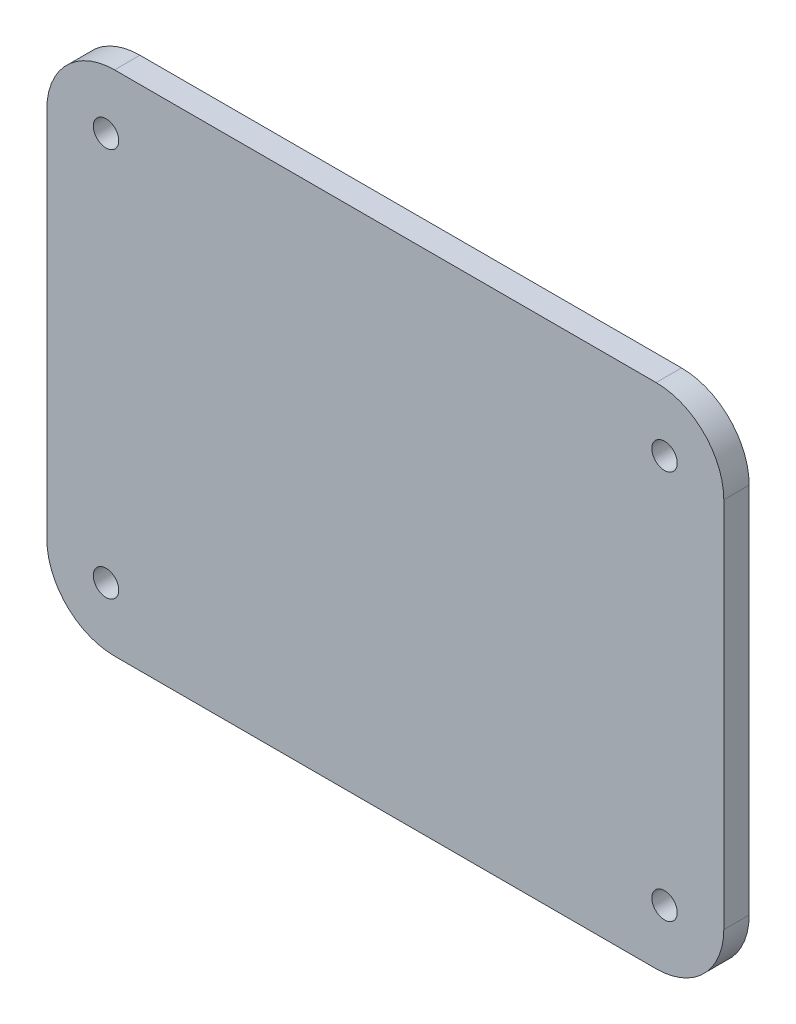
ISO-10303-21;
HEADER;
FILE_DESCRIPTION(('STEP AP214'),'2;1');
FILE_NAME('part.step','',(''),(''),'','','');
FILE_SCHEMA(('AUTOMOTIVE_DESIGN { 1 0 10303 214 1 1 1 1 }'));
ENDSEC;
DATA;
#1=APPLICATION_CONTEXT('core data for automotive mechanical design processes');
#2=APPLICATION_PROTOCOL_DEFINITION('international standard','automotive_design',2000,#1);
#3=PRODUCT_CONTEXT('',#1,'mechanical');
#4=PRODUCT('Part','Part','',(#3));
#5=PRODUCT_RELATED_PRODUCT_CATEGORY('part','',(#4));
#6=PRODUCT_DEFINITION_FORMATION('','',#4);
#7=PRODUCT_DEFINITION_CONTEXT('part definition',#1,'design');
#8=PRODUCT_DEFINITION('design','',#6,#7);
#9=PRODUCT_DEFINITION_SHAPE('','',#8);
#10=(LENGTH_UNIT() NAMED_UNIT(*) SI_UNIT(.MILLI.,.METRE.));
#11=(NAMED_UNIT(*) PLANE_ANGLE_UNIT() SI_UNIT($,.RADIAN.));
#12=(NAMED_UNIT(*) SI_UNIT($,.STERADIAN.) SOLID_ANGLE_UNIT());
#13=UNCERTAINTY_MEASURE_WITH_UNIT(LENGTH_MEASURE(1.E-05),#10,'distance_accuracy_value','');
#14=(GEOMETRIC_REPRESENTATION_CONTEXT(3) GLOBAL_UNCERTAINTY_ASSIGNED_CONTEXT((#13)) GLOBAL_UNIT_ASSIGNED_CONTEXT((#10,
#11,#12)) REPRESENTATION_CONTEXT('',''));
#15=CARTESIAN_POINT('',(0.,0.,0.));
#16=DIRECTION('',(0.,0.,1.));
#17=DIRECTION('',(1.,0.,0.));
#18=AXIS2_PLACEMENT_3D('',#15,#16,#17);
#19=CARTESIAN_POINT('',(-40.,30.,3.));
#20=DIRECTION('',(1.,0.,0.));
#21=DIRECTION('',(0.,1.,0.));
#22=AXIS2_PLACEMENT_3D('',#19,#20,#21);
#23=PLANE('',#22);
#24=DIRECTION('',(0.,-1.,0.));
#25=VECTOR('',#24,1.);
#26=CARTESIAN_POINT('',(-40.,30.,3.));
#27=LINE('',#26,#25);
#28=CARTESIAN_POINT('',(-40.,22.,3.));
#29=VERTEX_POINT('',#28);
#30=CARTESIAN_POINT('',(-40.,-22.,3.));
#31=VERTEX_POINT('',#30);
#32=EDGE_CURVE('E118',#29,#31,#27,.T.);
#33=ORIENTED_EDGE('',*,*,#32,.F.);
#34=DIRECTION('',(0.,0.,-1.));
#35=VECTOR('',#34,1.);
#36=CARTESIAN_POINT('',(-40.,22.,3.));
#37=LINE('',#36,#35);
#38=CARTESIAN_POINT('',(-40.,22.,0.));
#39=VERTEX_POINT('',#38);
#40=EDGE_CURVE('E103',#29,#39,#37,.T.);
#41=ORIENTED_EDGE('',*,*,#40,.T.);
#42=DIRECTION('',(0.,-1.,0.));
#43=VECTOR('',#42,1.);
#44=CARTESIAN_POINT('',(-40.,30.,0.));
#45=LINE('',#44,#43);
#46=CARTESIAN_POINT('',(-40.,-22.,0.));
#47=VERTEX_POINT('',#46);
#48=EDGE_CURVE('E115',#39,#47,#45,.T.);
#49=ORIENTED_EDGE('',*,*,#48,.T.);
#50=DIRECTION('',(0.,0.,-1.));
#51=VECTOR('',#50,1.);
#52=CARTESIAN_POINT('',(-40.,-22.,3.));
#53=LINE('',#52,#51);
#54=EDGE_CURVE('E120',#47,#31,#53,.F.);
#55=ORIENTED_EDGE('',*,*,#54,.T.);
#56=EDGE_LOOP('',(#33,#41,#49,#55));
#57=FACE_BOUND('',#56,.T.);
#58=ADVANCED_FACE('F33',(#57),#23,.F.);
#59=CARTESIAN_POINT('',(-40.,-30.,3.));
#60=DIRECTION('',(0.,1.,0.));
#61=DIRECTION('',(0.,0.,1.));
#62=AXIS2_PLACEMENT_3D('',#59,#60,#61);
#63=PLANE('',#62);
#64=DIRECTION('',(1.,0.,0.));
#65=VECTOR('',#64,1.);
#66=CARTESIAN_POINT('',(-40.,-30.,3.));
#67=LINE('',#66,#65);
#68=CARTESIAN_POINT('',(-32.,-30.,3.));
#69=VERTEX_POINT('',#68);
#70=CARTESIAN_POINT('',(32.,-30.,3.));
#71=VERTEX_POINT('',#70);
#72=EDGE_CURVE('E164',#69,#71,#67,.T.);
#73=ORIENTED_EDGE('',*,*,#72,.F.);
#74=DIRECTION('',(0.,0.,-1.));
#75=VECTOR('',#74,1.);
#76=CARTESIAN_POINT('',(-32.,-30.,3.));
#77=LINE('',#76,#75);
#78=CARTESIAN_POINT('',(-32.,-30.,0.));
#79=VERTEX_POINT('',#78);
#80=EDGE_CURVE('E157',#69,#79,#77,.T.);
#81=ORIENTED_EDGE('',*,*,#80,.T.);
#82=DIRECTION('',(1.,0.,0.));
#83=VECTOR('',#82,1.);
#84=CARTESIAN_POINT('',(-40.,-30.,0.));
#85=LINE('',#84,#83);
#86=CARTESIAN_POINT('',(32.,-30.,0.));
#87=VERTEX_POINT('',#86);
#88=EDGE_CURVE('E124',#79,#87,#85,.T.);
#89=ORIENTED_EDGE('',*,*,#88,.T.);
#90=DIRECTION('',(0.,0.,-1.));
#91=VECTOR('',#90,1.);
#92=CARTESIAN_POINT('',(32.,-30.,3.));
#93=LINE('',#92,#91);
#94=EDGE_CURVE('E155',#87,#71,#93,.F.);
#95=ORIENTED_EDGE('',*,*,#94,.T.);
#96=EDGE_LOOP('',(#73,#81,#89,#95));
#97=FACE_BOUND('',#96,.T.);
#98=ADVANCED_FACE('F162',(#97),#63,.F.);
#99=CARTESIAN_POINT('',(40.,30.,3.));
#100=DIRECTION('',(-1.,0.,0.));
#101=DIRECTION('',(0.,-1.,0.));
#102=AXIS2_PLACEMENT_3D('',#99,#100,#101);
#103=PLANE('',#102);
#104=DIRECTION('',(0.,1.,0.));
#105=VECTOR('',#104,1.);
#106=CARTESIAN_POINT('',(40.,30.,3.));
#107=LINE('',#106,#105);
#108=CARTESIAN_POINT('',(40.,-22.,3.));
#109=VERTEX_POINT('',#108);
#110=CARTESIAN_POINT('',(40.,22.,3.));
#111=VERTEX_POINT('',#110);
#112=EDGE_CURVE('E172',#109,#111,#107,.T.);
#113=ORIENTED_EDGE('',*,*,#112,.F.);
#114=DIRECTION('',(0.,0.,-1.));
#115=VECTOR('',#114,1.);
#116=CARTESIAN_POINT('',(40.,-22.,3.));
#117=LINE('',#116,#115);
#118=CARTESIAN_POINT('',(40.,-22.,0.));
#119=VERTEX_POINT('',#118);
#120=EDGE_CURVE('E11',#109,#119,#117,.T.);
#121=ORIENTED_EDGE('',*,*,#120,.T.);
#122=DIRECTION('',(0.,1.,0.));
#123=VECTOR('',#122,1.);
#124=CARTESIAN_POINT('',(40.,30.,0.));
#125=LINE('',#124,#123);
#126=CARTESIAN_POINT('',(40.,22.,0.));
#127=VERTEX_POINT('',#126);
#128=EDGE_CURVE('E128',#119,#127,#125,.T.);
#129=ORIENTED_EDGE('',*,*,#128,.T.);
#130=DIRECTION('',(0.,0.,-1.));
#131=VECTOR('',#130,1.);
#132=CARTESIAN_POINT('',(40.,22.,3.));
#133=LINE('',#132,#131);
#134=EDGE_CURVE('E41',#127,#111,#133,.F.);
#135=ORIENTED_EDGE('',*,*,#134,.T.);
#136=EDGE_LOOP('',(#113,#121,#129,#135));
#137=FACE_BOUND('',#136,.T.);
#138=ADVANCED_FACE('F171',(#137),#103,.F.);
#139=CARTESIAN_POINT('',(-40.,30.,3.));
#140=DIRECTION('',(0.,-1.,0.));
#141=DIRECTION('',(0.,0.,-1.));
#142=AXIS2_PLACEMENT_3D('',#139,#140,#141);
#143=PLANE('',#142);
#144=DIRECTION('',(-1.,0.,0.));
#145=VECTOR('',#144,1.);
#146=CARTESIAN_POINT('',(-40.,30.,0.));
#147=LINE('',#146,#145);
#148=CARTESIAN_POINT('',(32.,30.,0.));
#149=VERTEX_POINT('',#148);
#150=CARTESIAN_POINT('',(-32.,30.,0.));
#151=VERTEX_POINT('',#150);
#152=EDGE_CURVE('E138',#149,#151,#147,.T.);
#153=ORIENTED_EDGE('',*,*,#152,.T.);
#154=DIRECTION('',(0.,0.,-1.));
#155=VECTOR('',#154,1.);
#156=CARTESIAN_POINT('',(-32.,30.,3.));
#157=LINE('',#156,#155);
#158=CARTESIAN_POINT('',(-32.,30.,3.));
#159=VERTEX_POINT('',#158);
#160=EDGE_CURVE('E104',#151,#159,#157,.F.);
#161=ORIENTED_EDGE('',*,*,#160,.T.);
#162=DIRECTION('',(-1.,0.,0.));
#163=VECTOR('',#162,1.);
#164=CARTESIAN_POINT('',(-40.,30.,3.));
#165=LINE('',#164,#163);
#166=CARTESIAN_POINT('',(32.,30.,3.));
#167=VERTEX_POINT('',#166);
#168=EDGE_CURVE('E134',#167,#159,#165,.T.);
#169=ORIENTED_EDGE('',*,*,#168,.F.);
#170=DIRECTION('',(0.,0.,-1.));
#171=VECTOR('',#170,1.);
#172=CARTESIAN_POINT('',(32.,30.,3.));
#173=LINE('',#172,#171);
#174=EDGE_CURVE('E109',#167,#149,#173,.T.);
#175=ORIENTED_EDGE('',*,*,#174,.T.);
#176=EDGE_LOOP('',(#153,#161,#169,#175));
#177=FACE_BOUND('',#176,.T.);
#178=ADVANCED_FACE('F216',(#177),#143,.F.);
#179=CARTESIAN_POINT('',(0.,0.,3.));
#180=DIRECTION('',(0.,0.,1.));
#181=DIRECTION('',(1.,0.,0.));
#182=AXIS2_PLACEMENT_3D('',#179,#180,#181);
#183=PLANE('',#182);
#184=CARTESIAN_POINT('',(33.,-23.,3.));
#185=DIRECTION('',(0.,0.,1.));
#186=DIRECTION('',(1.,0.,0.));
#187=AXIS2_PLACEMENT_3D('',#184,#185,#186);
#188=CIRCLE('',#187,1.50000000000002);
#189=CARTESIAN_POINT('',(31.5,-23.,3.));
#190=VERTEX_POINT('',#189);
#191=EDGE_CURVE('E181',#190,#190,#188,.F.);
#192=ORIENTED_EDGE('',*,*,#191,.T.);
#193=EDGE_LOOP('',(#192));
#194=FACE_BOUND('',#193,.T.);
#195=CARTESIAN_POINT('',(33.,23.,3.));
#196=DIRECTION('',(0.,0.,1.));
#197=DIRECTION('',(1.,0.,0.));
#198=AXIS2_PLACEMENT_3D('',#195,#196,#197);
#199=CIRCLE('',#198,1.50000000000002);
#200=CARTESIAN_POINT('',(31.5,23.,3.));
#201=VERTEX_POINT('',#200);
#202=EDGE_CURVE('E188',#201,#201,#199,.F.);
#203=ORIENTED_EDGE('',*,*,#202,.T.);
#204=EDGE_LOOP('',(#203));
#205=FACE_BOUND('',#204,.T.);
#206=CARTESIAN_POINT('',(-33.,23.,3.));
#207=DIRECTION('',(0.,0.,1.));
#208=DIRECTION('',(1.,0.,0.));
#209=AXIS2_PLACEMENT_3D('',#206,#207,#208);
#210=CIRCLE('',#209,1.49999999999999);
#211=CARTESIAN_POINT('',(-34.5,23.,3.));
#212=VERTEX_POINT('',#211);
#213=EDGE_CURVE('E180',#212,#212,#210,.F.);
#214=ORIENTED_EDGE('',*,*,#213,.T.);
#215=EDGE_LOOP('',(#214));
#216=FACE_BOUND('',#215,.T.);
#217=CARTESIAN_POINT('',(-33.,-23.,3.));
#218=DIRECTION('',(0.,0.,1.));
#219=DIRECTION('',(1.,0.,0.));
#220=AXIS2_PLACEMENT_3D('',#217,#218,#219);
#221=CIRCLE('',#220,1.5);
#222=CARTESIAN_POINT('',(-34.5,-23.,3.));
#223=VERTEX_POINT('',#222);
#224=EDGE_CURVE('E125',#223,#223,#221,.F.);
#225=ORIENTED_EDGE('',*,*,#224,.T.);
#226=EDGE_LOOP('',(#225));
#227=FACE_BOUND('',#226,.T.);
#228=ORIENTED_EDGE('',*,*,#168,.T.);
#229=CARTESIAN_POINT('',(-32.,22.,3.));
#230=DIRECTION('',(0.,0.,1.));
#231=DIRECTION('',(1.,0.,0.));
#232=AXIS2_PLACEMENT_3D('',#229,#230,#231);
#233=CIRCLE('',#232,8.);
#234=EDGE_CURVE('E153',#159,#29,#233,.T.);
#235=ORIENTED_EDGE('',*,*,#234,.T.);
#236=ORIENTED_EDGE('',*,*,#32,.T.);
#237=CARTESIAN_POINT('',(-32.,-22.,3.));
#238=DIRECTION('',(0.,0.,1.));
#239=DIRECTION('',(1.,0.,0.));
#240=AXIS2_PLACEMENT_3D('',#237,#238,#239);
#241=CIRCLE('',#240,8.);
#242=EDGE_CURVE('E151',#31,#69,#241,.T.);
#243=ORIENTED_EDGE('',*,*,#242,.T.);
#244=ORIENTED_EDGE('',*,*,#72,.T.);
#245=CARTESIAN_POINT('',(32.,-22.,3.));
#246=DIRECTION('',(0.,0.,1.));
#247=DIRECTION('',(1.,0.,0.));
#248=AXIS2_PLACEMENT_3D('',#245,#246,#247);
#249=CIRCLE('',#248,8.);
#250=EDGE_CURVE('E54',#71,#109,#249,.T.);
#251=ORIENTED_EDGE('',*,*,#250,.T.);
#252=ORIENTED_EDGE('',*,*,#112,.T.);
#253=CARTESIAN_POINT('',(32.,22.,3.));
#254=DIRECTION('',(0.,0.,1.));
#255=DIRECTION('',(1.,0.,0.));
#256=AXIS2_PLACEMENT_3D('',#253,#254,#255);
#257=CIRCLE('',#256,8.);
#258=EDGE_CURVE('E148',#111,#167,#257,.T.);
#259=ORIENTED_EDGE('',*,*,#258,.T.);
#260=EDGE_LOOP('',(#228,#235,#236,#243,#244,#251,#252,#259));
#261=FACE_BOUND('',#260,.T.);
#262=ADVANCED_FACE('F204',(#194,#205,#216,#227,#261),#183,.T.);
#263=CARTESIAN_POINT('',(0.,0.,0.));
#264=DIRECTION('',(0.,0.,1.));
#265=DIRECTION('',(1.,0.,0.));
#266=AXIS2_PLACEMENT_3D('',#263,#264,#265);
#267=PLANE('',#266);
#268=CARTESIAN_POINT('',(33.,-23.,0.));
#269=DIRECTION('',(0.,0.,-1.));
#270=DIRECTION('',(-1.,0.,0.));
#271=AXIS2_PLACEMENT_3D('',#268,#269,#270);
#272=CIRCLE('',#271,1.50000000000002);
#273=CARTESIAN_POINT('',(31.5,-23.,0.));
#274=VERTEX_POINT('',#273);
#275=EDGE_CURVE('E185',#274,#274,#272,.T.);
#276=ORIENTED_EDGE('',*,*,#275,.F.);
#277=EDGE_LOOP('',(#276));
#278=FACE_BOUND('',#277,.T.);
#279=CARTESIAN_POINT('',(33.,23.,0.));
#280=DIRECTION('',(0.,0.,-1.));
#281=DIRECTION('',(-1.,0.,0.));
#282=AXIS2_PLACEMENT_3D('',#279,#280,#281);
#283=CIRCLE('',#282,1.50000000000002);
#284=CARTESIAN_POINT('',(31.5,23.,0.));
#285=VERTEX_POINT('',#284);
#286=EDGE_CURVE('E184',#285,#285,#283,.T.);
#287=ORIENTED_EDGE('',*,*,#286,.F.);
#288=EDGE_LOOP('',(#287));
#289=FACE_BOUND('',#288,.T.);
#290=CARTESIAN_POINT('',(-33.,23.,0.));
#291=DIRECTION('',(0.,0.,-1.));
#292=DIRECTION('',(-1.,0.,0.));
#293=AXIS2_PLACEMENT_3D('',#290,#291,#292);
#294=CIRCLE('',#293,1.49999999999999);
#295=CARTESIAN_POINT('',(-34.5,23.,0.));
#296=VERTEX_POINT('',#295);
#297=EDGE_CURVE('E191',#296,#296,#294,.T.);
#298=ORIENTED_EDGE('',*,*,#297,.F.);
#299=EDGE_LOOP('',(#298));
#300=FACE_BOUND('',#299,.T.);
#301=CARTESIAN_POINT('',(-33.,-23.,0.));
#302=DIRECTION('',(0.,0.,-1.));
#303=DIRECTION('',(-1.,0.,0.));
#304=AXIS2_PLACEMENT_3D('',#301,#302,#303);
#305=CIRCLE('',#304,1.5);
#306=CARTESIAN_POINT('',(-34.5,-23.,0.));
#307=VERTEX_POINT('',#306);
#308=EDGE_CURVE('E131',#307,#307,#305,.T.);
#309=ORIENTED_EDGE('',*,*,#308,.F.);
#310=EDGE_LOOP('',(#309));
#311=FACE_BOUND('',#310,.T.);
#312=ORIENTED_EDGE('',*,*,#48,.F.);
#313=CARTESIAN_POINT('',(-32.,22.,0.));
#314=DIRECTION('',(0.,0.,1.));
#315=DIRECTION('',(1.,0.,0.));
#316=AXIS2_PLACEMENT_3D('',#313,#314,#315);
#317=CIRCLE('',#316,8.);
#318=EDGE_CURVE('E99',#39,#151,#317,.F.);
#319=ORIENTED_EDGE('',*,*,#318,.T.);
#320=ORIENTED_EDGE('',*,*,#152,.F.);
#321=CARTESIAN_POINT('',(32.,22.,0.));
#322=DIRECTION('',(0.,0.,1.));
#323=DIRECTION('',(1.,0.,0.));
#324=AXIS2_PLACEMENT_3D('',#321,#322,#323);
#325=CIRCLE('',#324,8.);
#326=EDGE_CURVE('E119',#149,#127,#325,.F.);
#327=ORIENTED_EDGE('',*,*,#326,.T.);
#328=ORIENTED_EDGE('',*,*,#128,.F.);
#329=CARTESIAN_POINT('',(32.,-22.,0.));
#330=DIRECTION('',(0.,0.,1.));
#331=DIRECTION('',(1.,0.,0.));
#332=AXIS2_PLACEMENT_3D('',#329,#330,#331);
#333=CIRCLE('',#332,8.);
#334=EDGE_CURVE('E142',#119,#87,#333,.F.);
#335=ORIENTED_EDGE('',*,*,#334,.T.);
#336=ORIENTED_EDGE('',*,*,#88,.F.);
#337=CARTESIAN_POINT('',(-32.,-22.,0.));
#338=DIRECTION('',(0.,0.,1.));
#339=DIRECTION('',(1.,0.,0.));
#340=AXIS2_PLACEMENT_3D('',#337,#338,#339);
#341=CIRCLE('',#340,8.);
#342=EDGE_CURVE('E110',#79,#47,#341,.F.);
#343=ORIENTED_EDGE('',*,*,#342,.T.);
#344=EDGE_LOOP('',(#312,#319,#320,#327,#328,#335,#336,#343));
#345=FACE_BOUND('',#344,.T.);
#346=ADVANCED_FACE('F122',(#278,#289,#300,#311,#345),#267,.F.);
#347=CARTESIAN_POINT('',(-32.,22.,3.));
#348=DIRECTION('',(0.,0.,-1.));
#349=DIRECTION('',(-1.,0.,0.));
#350=AXIS2_PLACEMENT_3D('',#347,#348,#349);
#351=CYLINDRICAL_SURFACE('',#350,8.);
#352=ORIENTED_EDGE('',*,*,#234,.F.);
#353=ORIENTED_EDGE('',*,*,#160,.F.);
#354=ORIENTED_EDGE('',*,*,#318,.F.);
#355=ORIENTED_EDGE('',*,*,#40,.F.);
#356=EDGE_LOOP('',(#352,#353,#354,#355));
#357=FACE_BOUND('',#356,.T.);
#358=ADVANCED_FACE('F102',(#357),#351,.T.);
#359=CARTESIAN_POINT('',(-32.,-22.,3.));
#360=DIRECTION('',(0.,0.,-1.));
#361=DIRECTION('',(-1.,0.,0.));
#362=AXIS2_PLACEMENT_3D('',#359,#360,#361);
#363=CYLINDRICAL_SURFACE('',#362,8.);
#364=ORIENTED_EDGE('',*,*,#242,.F.);
#365=ORIENTED_EDGE('',*,*,#54,.F.);
#366=ORIENTED_EDGE('',*,*,#342,.F.);
#367=ORIENTED_EDGE('',*,*,#80,.F.);
#368=EDGE_LOOP('',(#364,#365,#366,#367));
#369=FACE_BOUND('',#368,.T.);
#370=ADVANCED_FACE('F227',(#369),#363,.T.);
#371=CARTESIAN_POINT('',(32.,-22.,3.));
#372=DIRECTION('',(0.,0.,-1.));
#373=DIRECTION('',(-1.,0.,0.));
#374=AXIS2_PLACEMENT_3D('',#371,#372,#373);
#375=CYLINDRICAL_SURFACE('',#374,8.);
#376=ORIENTED_EDGE('',*,*,#250,.F.);
#377=ORIENTED_EDGE('',*,*,#94,.F.);
#378=ORIENTED_EDGE('',*,*,#334,.F.);
#379=ORIENTED_EDGE('',*,*,#120,.F.);
#380=EDGE_LOOP('',(#376,#377,#378,#379));
#381=FACE_BOUND('',#380,.T.);
#382=ADVANCED_FACE('F170',(#381),#375,.T.);
#383=CARTESIAN_POINT('',(32.,22.,3.));
#384=DIRECTION('',(0.,0.,-1.));
#385=DIRECTION('',(-1.,0.,0.));
#386=AXIS2_PLACEMENT_3D('',#383,#384,#385);
#387=CYLINDRICAL_SURFACE('',#386,8.);
#388=ORIENTED_EDGE('',*,*,#258,.F.);
#389=ORIENTED_EDGE('',*,*,#134,.F.);
#390=ORIENTED_EDGE('',*,*,#326,.F.);
#391=ORIENTED_EDGE('',*,*,#174,.F.);
#392=EDGE_LOOP('',(#388,#389,#390,#391));
#393=FACE_BOUND('',#392,.T.);
#394=ADVANCED_FACE('F35',(#393),#387,.T.);
#395=CARTESIAN_POINT('',(-33.,-23.,7.24264068711933));
#396=DIRECTION('',(0.,0.,-1.));
#397=DIRECTION('',(-1.,0.,0.));
#398=AXIS2_PLACEMENT_3D('',#395,#396,#397);
#399=CYLINDRICAL_SURFACE('',#398,1.5);
#400=CARTESIAN_POINT('',(-34.5,-23.,0.));
#401=CARTESIAN_POINT('',(-34.5,-23.,0.0312500000000009));
#402=CARTESIAN_POINT('',(-34.5,-23.,0.0625000000000009));
#403=CARTESIAN_POINT('',(-34.5,-23.,0.125000000000001));
#404=CARTESIAN_POINT('',(-34.5,-23.,0.156250000000001));
#405=CARTESIAN_POINT('',(-34.5,-23.,0.218750000000001));
#406=CARTESIAN_POINT('',(-34.5,-23.,0.250000000000001));
#407=CARTESIAN_POINT('',(-34.5,-23.,0.312500000000001));
#408=CARTESIAN_POINT('',(-34.5,-23.,0.343750000000001));
#409=CARTESIAN_POINT('',(-34.5,-23.,0.406250000000001));
#410=CARTESIAN_POINT('',(-34.5,-23.,0.437500000000001));
#411=CARTESIAN_POINT('',(-34.5,-23.,0.5));
#412=CARTESIAN_POINT('',(-34.5,-23.,0.53125));
#413=CARTESIAN_POINT('',(-34.5,-23.,0.593750000000001));
#414=CARTESIAN_POINT('',(-34.5,-23.,0.625000000000001));
#415=CARTESIAN_POINT('',(-34.5,-23.,0.687500000000001));
#416=CARTESIAN_POINT('',(-34.5,-23.,0.718750000000001));
#417=CARTESIAN_POINT('',(-34.5,-23.,0.781250000000001));
#418=CARTESIAN_POINT('',(-34.5,-23.,0.812500000000001));
#419=CARTESIAN_POINT('',(-34.5,-23.,0.875000000000001));
#420=CARTESIAN_POINT('',(-34.5,-23.,0.906250000000001));
#421=CARTESIAN_POINT('',(-34.5,-23.,0.968750000000001));
#422=CARTESIAN_POINT('',(-34.5,-23.,1.));
#423=CARTESIAN_POINT('',(-34.5,-23.,1.0625));
#424=CARTESIAN_POINT('',(-34.5,-23.,1.09375));
#425=CARTESIAN_POINT('',(-34.5,-23.,1.15625));
#426=CARTESIAN_POINT('',(-34.5,-23.,1.1875));
#427=CARTESIAN_POINT('',(-34.5,-23.,1.25));
#428=CARTESIAN_POINT('',(-34.5,-23.,1.28125));
#429=CARTESIAN_POINT('',(-34.5,-23.,1.34375));
#430=CARTESIAN_POINT('',(-34.5,-23.,1.375));
#431=CARTESIAN_POINT('',(-34.5,-23.,1.4375));
#432=CARTESIAN_POINT('',(-34.5,-23.,1.46875));
#433=CARTESIAN_POINT('',(-34.5,-23.,1.53125));
#434=CARTESIAN_POINT('',(-34.5,-23.,1.5625));
#435=CARTESIAN_POINT('',(-34.5,-23.,1.625));
#436=CARTESIAN_POINT('',(-34.5,-23.,1.65625));
#437=CARTESIAN_POINT('',(-34.5,-23.,1.71875));
#438=CARTESIAN_POINT('',(-34.5,-23.,1.75));
#439=CARTESIAN_POINT('',(-34.5,-23.,1.8125));
#440=CARTESIAN_POINT('',(-34.5,-23.,1.84375));
#441=CARTESIAN_POINT('',(-34.5,-23.,1.90625));
#442=CARTESIAN_POINT('',(-34.5,-23.,1.9375));
#443=CARTESIAN_POINT('',(-34.5,-23.,2.));
#444=CARTESIAN_POINT('',(-34.5,-23.,2.03125));
#445=CARTESIAN_POINT('',(-34.5,-23.,2.09375));
#446=CARTESIAN_POINT('',(-34.5,-23.,2.125));
#447=CARTESIAN_POINT('',(-34.5,-23.,2.1875));
#448=CARTESIAN_POINT('',(-34.5,-23.,2.21875));
#449=CARTESIAN_POINT('',(-34.5,-23.,2.28125));
#450=CARTESIAN_POINT('',(-34.5,-23.,2.3125));
#451=CARTESIAN_POINT('',(-34.5,-23.,2.375));
#452=CARTESIAN_POINT('',(-34.5,-23.,2.40625));
#453=CARTESIAN_POINT('',(-34.5,-23.,2.46875));
#454=CARTESIAN_POINT('',(-34.5,-23.,2.5));
#455=CARTESIAN_POINT('',(-34.5,-23.,2.5625));
#456=CARTESIAN_POINT('',(-34.5,-23.,2.59375));
#457=CARTESIAN_POINT('',(-34.5,-23.,2.65625));
#458=CARTESIAN_POINT('',(-34.5,-23.,2.6875));
#459=CARTESIAN_POINT('',(-34.5,-23.,2.75));
#460=CARTESIAN_POINT('',(-34.5,-23.,2.78125));
#461=CARTESIAN_POINT('',(-34.5,-23.,2.84375));
#462=CARTESIAN_POINT('',(-34.5,-23.,2.875));
#463=CARTESIAN_POINT('',(-34.5,-23.,2.9375));
#464=CARTESIAN_POINT('',(-34.5,-23.,2.96875));
#465=CARTESIAN_POINT('',(-34.5,-23.,3.));
#466=B_SPLINE_CURVE_WITH_KNOTS('',3,(#400,#401,#402,#403,#404,#405,#406,#407,#408,#409,#410,
#411,#412,#413,#414,#415,#416,#417,#418,#419,#420,#421,#422,#423,#424,#425,#426,#427,#428,#429,
#430,#431,#432,#433,#434,#435,#436,#437,#438,#439,#440,#441,#442,#443,#444,#445,#446,#447,#448,
#449,#450,#451,#452,#453,#454,#455,#456,#457,#458,#459,#460,#461,#462,#463,#464,#465),
.UNSPECIFIED.,.F.,.F.,(4,2,2,2,2,2,2,2,2,2,2,2,2,2,2,2,2,2,2,2,2,2,2,2,2,2,2,2,2,2,2,2,4),(0.,
0.0937500000000001,0.1875,0.28125,0.375,0.46875,0.5625,0.65625,0.75,0.84375,0.9375,1.03125,
1.125,1.21875,1.3125,1.40625,1.5,1.59375,1.6875,1.78125,1.875,1.96875,2.0625,2.15625,2.25,
2.34375,2.4375,2.53125,2.625,2.71875,2.8125,2.90625,3.),.UNSPECIFIED.);
#467=EDGE_CURVE('BSEAM209',#307,#223,#466,.T.);
#468=ORIENTED_EDGE('',*,*,#308,.T.);
#469=ORIENTED_EDGE('',*,*,#224,.F.);
#470=ORIENTED_EDGE('',*,*,#467,.T.);
#471=ORIENTED_EDGE('',*,*,#467,.F.);
#472=EDGE_LOOP('',(#468,#470,#469,#471));
#473=FACE_BOUND('',#472,.T.);
#474=ADVANCED_FACE('F209',(#473),#399,.F.);
#475=CARTESIAN_POINT('',(-33.,23.,7.24264068711933));
#476=DIRECTION('',(0.,0.,-1.));
#477=DIRECTION('',(-1.,0.,0.));
#478=AXIS2_PLACEMENT_3D('',#475,#476,#477);
#479=CYLINDRICAL_SURFACE('',#478,1.49999999999999);
#480=CARTESIAN_POINT('',(-34.5,23.,0.));
#481=CARTESIAN_POINT('',(-34.5,23.,0.0312500000000009));
#482=CARTESIAN_POINT('',(-34.5,23.,0.0625000000000009));
#483=CARTESIAN_POINT('',(-34.5,23.,0.125000000000001));
#484=CARTESIAN_POINT('',(-34.5,23.,0.156250000000001));
#485=CARTESIAN_POINT('',(-34.5,23.,0.218750000000001));
#486=CARTESIAN_POINT('',(-34.5,23.,0.250000000000001));
#487=CARTESIAN_POINT('',(-34.5,23.,0.312500000000001));
#488=CARTESIAN_POINT('',(-34.5,23.,0.343750000000001));
#489=CARTESIAN_POINT('',(-34.5,23.,0.406250000000001));
#490=CARTESIAN_POINT('',(-34.5,23.,0.437500000000001));
#491=CARTESIAN_POINT('',(-34.5,23.,0.5));
#492=CARTESIAN_POINT('',(-34.5,23.,0.53125));
#493=CARTESIAN_POINT('',(-34.5,23.,0.593750000000001));
#494=CARTESIAN_POINT('',(-34.5,23.,0.625000000000001));
#495=CARTESIAN_POINT('',(-34.5,23.,0.687500000000001));
#496=CARTESIAN_POINT('',(-34.5,23.,0.718750000000001));
#497=CARTESIAN_POINT('',(-34.5,23.,0.781250000000001));
#498=CARTESIAN_POINT('',(-34.5,23.,0.812500000000001));
#499=CARTESIAN_POINT('',(-34.5,23.,0.875000000000001));
#500=CARTESIAN_POINT('',(-34.5,23.,0.906250000000001));
#501=CARTESIAN_POINT('',(-34.5,23.,0.968750000000001));
#502=CARTESIAN_POINT('',(-34.5,23.,1.));
#503=CARTESIAN_POINT('',(-34.5,23.,1.0625));
#504=CARTESIAN_POINT('',(-34.5,23.,1.09375));
#505=CARTESIAN_POINT('',(-34.5,23.,1.15625));
#506=CARTESIAN_POINT('',(-34.5,23.,1.1875));
#507=CARTESIAN_POINT('',(-34.5,23.,1.25));
#508=CARTESIAN_POINT('',(-34.5,23.,1.28125));
#509=CARTESIAN_POINT('',(-34.5,23.,1.34375));
#510=CARTESIAN_POINT('',(-34.5,23.,1.375));
#511=CARTESIAN_POINT('',(-34.5,23.,1.4375));
#512=CARTESIAN_POINT('',(-34.5,23.,1.46875));
#513=CARTESIAN_POINT('',(-34.5,23.,1.53125));
#514=CARTESIAN_POINT('',(-34.5,23.,1.5625));
#515=CARTESIAN_POINT('',(-34.5,23.,1.625));
#516=CARTESIAN_POINT('',(-34.5,23.,1.65625));
#517=CARTESIAN_POINT('',(-34.5,23.,1.71875));
#518=CARTESIAN_POINT('',(-34.5,23.,1.75));
#519=CARTESIAN_POINT('',(-34.5,23.,1.8125));
#520=CARTESIAN_POINT('',(-34.5,23.,1.84375));
#521=CARTESIAN_POINT('',(-34.5,23.,1.90625));
#522=CARTESIAN_POINT('',(-34.5,23.,1.9375));
#523=CARTESIAN_POINT('',(-34.5,23.,2.));
#524=CARTESIAN_POINT('',(-34.5,23.,2.03125));
#525=CARTESIAN_POINT('',(-34.5,23.,2.09375));
#526=CARTESIAN_POINT('',(-34.5,23.,2.125));
#527=CARTESIAN_POINT('',(-34.5,23.,2.1875));
#528=CARTESIAN_POINT('',(-34.5,23.,2.21875));
#529=CARTESIAN_POINT('',(-34.5,23.,2.28125));
#530=CARTESIAN_POINT('',(-34.5,23.,2.3125));
#531=CARTESIAN_POINT('',(-34.5,23.,2.375));
#532=CARTESIAN_POINT('',(-34.5,23.,2.40625));
#533=CARTESIAN_POINT('',(-34.5,23.,2.46875));
#534=CARTESIAN_POINT('',(-34.5,23.,2.5));
#535=CARTESIAN_POINT('',(-34.5,23.,2.5625));
#536=CARTESIAN_POINT('',(-34.5,23.,2.59375));
#537=CARTESIAN_POINT('',(-34.5,23.,2.65625));
#538=CARTESIAN_POINT('',(-34.5,23.,2.6875));
#539=CARTESIAN_POINT('',(-34.5,23.,2.75));
#540=CARTESIAN_POINT('',(-34.5,23.,2.78125));
#541=CARTESIAN_POINT('',(-34.5,23.,2.84375));
#542=CARTESIAN_POINT('',(-34.5,23.,2.875));
#543=CARTESIAN_POINT('',(-34.5,23.,2.9375));
#544=CARTESIAN_POINT('',(-34.5,23.,2.96875));
#545=CARTESIAN_POINT('',(-34.5,23.,3.));
#546=B_SPLINE_CURVE_WITH_KNOTS('',3,(#480,#481,#482,#483,#484,#485,#486,#487,#488,#489,#490,
#491,#492,#493,#494,#495,#496,#497,#498,#499,#500,#501,#502,#503,#504,#505,#506,#507,#508,#509,
#510,#511,#512,#513,#514,#515,#516,#517,#518,#519,#520,#521,#522,#523,#524,#525,#526,#527,#528,
#529,#530,#531,#532,#533,#534,#535,#536,#537,#538,#539,#540,#541,#542,#543,#544,#545),
.UNSPECIFIED.,.F.,.F.,(4,2,2,2,2,2,2,2,2,2,2,2,2,2,2,2,2,2,2,2,2,2,2,2,2,2,2,2,2,2,2,2,4),(0.,
0.0937500000000001,0.1875,0.28125,0.375,0.46875,0.5625,0.65625,0.75,0.84375,0.9375,1.03125,
1.125,1.21875,1.3125,1.40625,1.5,1.59375,1.6875,1.78125,1.875,1.96875,2.0625,2.15625,2.25,
2.34375,2.4375,2.53125,2.625,2.71875,2.8125,2.90625,3.),.UNSPECIFIED.);
#547=EDGE_CURVE('BSEAM199',#296,#212,#546,.T.);
#548=ORIENTED_EDGE('',*,*,#297,.T.);
#549=ORIENTED_EDGE('',*,*,#213,.F.);
#550=ORIENTED_EDGE('',*,*,#547,.T.);
#551=ORIENTED_EDGE('',*,*,#547,.F.);
#552=EDGE_LOOP('',(#548,#550,#549,#551));
#553=FACE_BOUND('',#552,.T.);
#554=ADVANCED_FACE('F199',(#553),#479,.F.);
#555=CARTESIAN_POINT('',(33.,23.,7.24264068711933));
#556=DIRECTION('',(0.,0.,-1.));
#557=DIRECTION('',(-1.,0.,0.));
#558=AXIS2_PLACEMENT_3D('',#555,#556,#557);
#559=CYLINDRICAL_SURFACE('',#558,1.50000000000002);
#560=CARTESIAN_POINT('',(31.5,23.,0.));
#561=CARTESIAN_POINT('',(31.5,23.,0.0312500000000009));
#562=CARTESIAN_POINT('',(31.5,23.,0.0625000000000009));
#563=CARTESIAN_POINT('',(31.5,23.,0.125000000000001));
#564=CARTESIAN_POINT('',(31.5,23.,0.156250000000001));
#565=CARTESIAN_POINT('',(31.5,23.,0.218750000000001));
#566=CARTESIAN_POINT('',(31.5,23.,0.250000000000001));
#567=CARTESIAN_POINT('',(31.5,23.,0.312500000000001));
#568=CARTESIAN_POINT('',(31.5,23.,0.343750000000001));
#569=CARTESIAN_POINT('',(31.5,23.,0.406250000000001));
#570=CARTESIAN_POINT('',(31.5,23.,0.437500000000001));
#571=CARTESIAN_POINT('',(31.5,23.,0.5));
#572=CARTESIAN_POINT('',(31.5,23.,0.53125));
#573=CARTESIAN_POINT('',(31.5,23.,0.593750000000001));
#574=CARTESIAN_POINT('',(31.5,23.,0.625000000000001));
#575=CARTESIAN_POINT('',(31.5,23.,0.687500000000001));
#576=CARTESIAN_POINT('',(31.5,23.,0.718750000000001));
#577=CARTESIAN_POINT('',(31.5,23.,0.781250000000001));
#578=CARTESIAN_POINT('',(31.5,23.,0.812500000000001));
#579=CARTESIAN_POINT('',(31.5,23.,0.875000000000001));
#580=CARTESIAN_POINT('',(31.5,23.,0.906250000000001));
#581=CARTESIAN_POINT('',(31.5,23.,0.968750000000001));
#582=CARTESIAN_POINT('',(31.5,23.,1.));
#583=CARTESIAN_POINT('',(31.5,23.,1.0625));
#584=CARTESIAN_POINT('',(31.5,23.,1.09375));
#585=CARTESIAN_POINT('',(31.5,23.,1.15625));
#586=CARTESIAN_POINT('',(31.5,23.,1.1875));
#587=CARTESIAN_POINT('',(31.5,23.,1.25));
#588=CARTESIAN_POINT('',(31.5,23.,1.28125));
#589=CARTESIAN_POINT('',(31.5,23.,1.34375));
#590=CARTESIAN_POINT('',(31.5,23.,1.375));
#591=CARTESIAN_POINT('',(31.5,23.,1.4375));
#592=CARTESIAN_POINT('',(31.5,23.,1.46875));
#593=CARTESIAN_POINT('',(31.5,23.,1.53125));
#594=CARTESIAN_POINT('',(31.5,23.,1.5625));
#595=CARTESIAN_POINT('',(31.5,23.,1.625));
#596=CARTESIAN_POINT('',(31.5,23.,1.65625));
#597=CARTESIAN_POINT('',(31.5,23.,1.71875));
#598=CARTESIAN_POINT('',(31.5,23.,1.75));
#599=CARTESIAN_POINT('',(31.5,23.,1.8125));
#600=CARTESIAN_POINT('',(31.5,23.,1.84375));
#601=CARTESIAN_POINT('',(31.5,23.,1.90625));
#602=CARTESIAN_POINT('',(31.5,23.,1.9375));
#603=CARTESIAN_POINT('',(31.5,23.,2.));
#604=CARTESIAN_POINT('',(31.5,23.,2.03125));
#605=CARTESIAN_POINT('',(31.5,23.,2.09375));
#606=CARTESIAN_POINT('',(31.5,23.,2.125));
#607=CARTESIAN_POINT('',(31.5,23.,2.1875));
#608=CARTESIAN_POINT('',(31.5,23.,2.21875));
#609=CARTESIAN_POINT('',(31.5,23.,2.28125));
#610=CARTESIAN_POINT('',(31.5,23.,2.3125));
#611=CARTESIAN_POINT('',(31.5,23.,2.375));
#612=CARTESIAN_POINT('',(31.5,23.,2.40625));
#613=CARTESIAN_POINT('',(31.5,23.,2.46875));
#614=CARTESIAN_POINT('',(31.5,23.,2.5));
#615=CARTESIAN_POINT('',(31.5,23.,2.5625));
#616=CARTESIAN_POINT('',(31.5,23.,2.59375));
#617=CARTESIAN_POINT('',(31.5,23.,2.65625));
#618=CARTESIAN_POINT('',(31.5,23.,2.6875));
#619=CARTESIAN_POINT('',(31.5,23.,2.75));
#620=CARTESIAN_POINT('',(31.5,23.,2.78125));
#621=CARTESIAN_POINT('',(31.5,23.,2.84375));
#622=CARTESIAN_POINT('',(31.5,23.,2.875));
#623=CARTESIAN_POINT('',(31.5,23.,2.9375));
#624=CARTESIAN_POINT('',(31.5,23.,2.96875));
#625=CARTESIAN_POINT('',(31.5,23.,3.));
#626=B_SPLINE_CURVE_WITH_KNOTS('',3,(#560,#561,#562,#563,#564,#565,#566,#567,#568,#569,#570,
#571,#572,#573,#574,#575,#576,#577,#578,#579,#580,#581,#582,#583,#584,#585,#586,#587,#588,#589,
#590,#591,#592,#593,#594,#595,#596,#597,#598,#599,#600,#601,#602,#603,#604,#605,#606,#607,#608,
#609,#610,#611,#612,#613,#614,#615,#616,#617,#618,#619,#620,#621,#622,#623,#624,#625),
.UNSPECIFIED.,.F.,.F.,(4,2,2,2,2,2,2,2,2,2,2,2,2,2,2,2,2,2,2,2,2,2,2,2,2,2,2,2,2,2,2,2,4),(0.,
0.0937500000000001,0.1875,0.28125,0.375,0.46875,0.5625,0.65625,0.75,0.84375,0.9375,1.03125,
1.125,1.21875,1.3125,1.40625,1.5,1.59375,1.6875,1.78125,1.875,1.96875,2.0625,2.15625,2.25,
2.34375,2.4375,2.53125,2.625,2.71875,2.8125,2.90625,3.),.UNSPECIFIED.);
#627=EDGE_CURVE('BSEAM281',#285,#201,#626,.T.);
#628=ORIENTED_EDGE('',*,*,#286,.T.);
#629=ORIENTED_EDGE('',*,*,#202,.F.);
#630=ORIENTED_EDGE('',*,*,#627,.T.);
#631=ORIENTED_EDGE('',*,*,#627,.F.);
#632=EDGE_LOOP('',(#628,#630,#629,#631));
#633=FACE_BOUND('',#632,.T.);
#634=ADVANCED_FACE('F281',(#633),#559,.F.);
#635=CARTESIAN_POINT('',(33.,-23.,7.24264068711933));
#636=DIRECTION('',(0.,0.,-1.));
#637=DIRECTION('',(-1.,0.,0.));
#638=AXIS2_PLACEMENT_3D('',#635,#636,#637);
#639=CYLINDRICAL_SURFACE('',#638,1.50000000000002);
#640=CARTESIAN_POINT('',(31.5,-23.,0.));
#641=CARTESIAN_POINT('',(31.5,-23.,0.0312500000000009));
#642=CARTESIAN_POINT('',(31.5,-23.,0.0625000000000009));
#643=CARTESIAN_POINT('',(31.5,-23.,0.125000000000001));
#644=CARTESIAN_POINT('',(31.5,-23.,0.156250000000001));
#645=CARTESIAN_POINT('',(31.5,-23.,0.218750000000001));
#646=CARTESIAN_POINT('',(31.5,-23.,0.250000000000001));
#647=CARTESIAN_POINT('',(31.5,-23.,0.312500000000001));
#648=CARTESIAN_POINT('',(31.5,-23.,0.343750000000001));
#649=CARTESIAN_POINT('',(31.5,-23.,0.406250000000001));
#650=CARTESIAN_POINT('',(31.5,-23.,0.437500000000001));
#651=CARTESIAN_POINT('',(31.5,-23.,0.5));
#652=CARTESIAN_POINT('',(31.5,-23.,0.53125));
#653=CARTESIAN_POINT('',(31.5,-23.,0.593750000000001));
#654=CARTESIAN_POINT('',(31.5,-23.,0.625000000000001));
#655=CARTESIAN_POINT('',(31.5,-23.,0.687500000000001));
#656=CARTESIAN_POINT('',(31.5,-23.,0.718750000000001));
#657=CARTESIAN_POINT('',(31.5,-23.,0.781250000000001));
#658=CARTESIAN_POINT('',(31.5,-23.,0.812500000000001));
#659=CARTESIAN_POINT('',(31.5,-23.,0.875000000000001));
#660=CARTESIAN_POINT('',(31.5,-23.,0.906250000000001));
#661=CARTESIAN_POINT('',(31.5,-23.,0.968750000000001));
#662=CARTESIAN_POINT('',(31.5,-23.,1.));
#663=CARTESIAN_POINT('',(31.5,-23.,1.0625));
#664=CARTESIAN_POINT('',(31.5,-23.,1.09375));
#665=CARTESIAN_POINT('',(31.5,-23.,1.15625));
#666=CARTESIAN_POINT('',(31.5,-23.,1.1875));
#667=CARTESIAN_POINT('',(31.5,-23.,1.25));
#668=CARTESIAN_POINT('',(31.5,-23.,1.28125));
#669=CARTESIAN_POINT('',(31.5,-23.,1.34375));
#670=CARTESIAN_POINT('',(31.5,-23.,1.375));
#671=CARTESIAN_POINT('',(31.5,-23.,1.4375));
#672=CARTESIAN_POINT('',(31.5,-23.,1.46875));
#673=CARTESIAN_POINT('',(31.5,-23.,1.53125));
#674=CARTESIAN_POINT('',(31.5,-23.,1.5625));
#675=CARTESIAN_POINT('',(31.5,-23.,1.625));
#676=CARTESIAN_POINT('',(31.5,-23.,1.65625));
#677=CARTESIAN_POINT('',(31.5,-23.,1.71875));
#678=CARTESIAN_POINT('',(31.5,-23.,1.75));
#679=CARTESIAN_POINT('',(31.5,-23.,1.8125));
#680=CARTESIAN_POINT('',(31.5,-23.,1.84375));
#681=CARTESIAN_POINT('',(31.5,-23.,1.90625));
#682=CARTESIAN_POINT('',(31.5,-23.,1.9375));
#683=CARTESIAN_POINT('',(31.5,-23.,2.));
#684=CARTESIAN_POINT('',(31.5,-23.,2.03125));
#685=CARTESIAN_POINT('',(31.5,-23.,2.09375));
#686=CARTESIAN_POINT('',(31.5,-23.,2.125));
#687=CARTESIAN_POINT('',(31.5,-23.,2.1875));
#688=CARTESIAN_POINT('',(31.5,-23.,2.21875));
#689=CARTESIAN_POINT('',(31.5,-23.,2.28125));
#690=CARTESIAN_POINT('',(31.5,-23.,2.3125));
#691=CARTESIAN_POINT('',(31.5,-23.,2.375));
#692=CARTESIAN_POINT('',(31.5,-23.,2.40625));
#693=CARTESIAN_POINT('',(31.5,-23.,2.46875));
#694=CARTESIAN_POINT('',(31.5,-23.,2.5));
#695=CARTESIAN_POINT('',(31.5,-23.,2.5625));
#696=CARTESIAN_POINT('',(31.5,-23.,2.59375));
#697=CARTESIAN_POINT('',(31.5,-23.,2.65625));
#698=CARTESIAN_POINT('',(31.5,-23.,2.6875));
#699=CARTESIAN_POINT('',(31.5,-23.,2.75));
#700=CARTESIAN_POINT('',(31.5,-23.,2.78125));
#701=CARTESIAN_POINT('',(31.5,-23.,2.84375));
#702=CARTESIAN_POINT('',(31.5,-23.,2.875));
#703=CARTESIAN_POINT('',(31.5,-23.,2.9375));
#704=CARTESIAN_POINT('',(31.5,-23.,2.96875));
#705=CARTESIAN_POINT('',(31.5,-23.,3.));
#706=B_SPLINE_CURVE_WITH_KNOTS('',3,(#640,#641,#642,#643,#644,#645,#646,#647,#648,#649,#650,
#651,#652,#653,#654,#655,#656,#657,#658,#659,#660,#661,#662,#663,#664,#665,#666,#667,#668,#669,
#670,#671,#672,#673,#674,#675,#676,#677,#678,#679,#680,#681,#682,#683,#684,#685,#686,#687,#688,
#689,#690,#691,#692,#693,#694,#695,#696,#697,#698,#699,#700,#701,#702,#703,#704,#705),
.UNSPECIFIED.,.F.,.F.,(4,2,2,2,2,2,2,2,2,2,2,2,2,2,2,2,2,2,2,2,2,2,2,2,2,2,2,2,2,2,2,2,4),(0.,
0.0937500000000001,0.1875,0.28125,0.375,0.46875,0.5625,0.65625,0.75,0.84375,0.9375,1.03125,
1.125,1.21875,1.3125,1.40625,1.5,1.59375,1.6875,1.78125,1.875,1.96875,2.0625,2.15625,2.25,
2.34375,2.4375,2.53125,2.625,2.71875,2.8125,2.90625,3.),.UNSPECIFIED.);
#707=EDGE_CURVE('BSEAM290',#274,#190,#706,.T.);
#708=ORIENTED_EDGE('',*,*,#275,.T.);
#709=ORIENTED_EDGE('',*,*,#191,.F.);
#710=ORIENTED_EDGE('',*,*,#707,.T.);
#711=ORIENTED_EDGE('',*,*,#707,.F.);
#712=EDGE_LOOP('',(#708,#710,#709,#711));
#713=FACE_BOUND('',#712,.T.);
#714=ADVANCED_FACE('F290',(#713),#639,.F.);
#715=CLOSED_SHELL('',(#58,#98,#138,#178,#262,#346,#358,#370,#382,#394,#474,#554,#634,#714));
#716=MANIFOLD_SOLID_BREP('B2',#715);
#717=ADVANCED_BREP_SHAPE_REPRESENTATION('',(#18,#716),#14);
#718=SHAPE_DEFINITION_REPRESENTATION(#9,#717);
ENDSEC;
END-ISO-10303-21;
